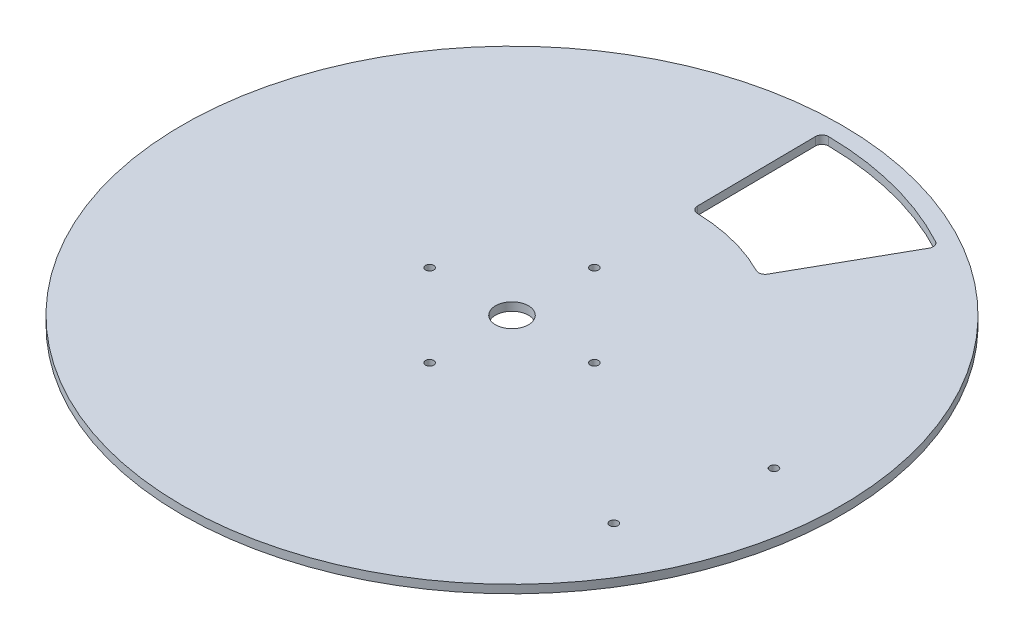
ISO-10303-21;
HEADER;
FILE_DESCRIPTION(('STEP AP214'),'2;1');
FILE_NAME('part.step','',(''),(''),'','','');
FILE_SCHEMA(('AUTOMOTIVE_DESIGN { 1 0 10303 214 1 1 1 1 }'));
ENDSEC;
DATA;
#1=APPLICATION_CONTEXT('core data for automotive mechanical design processes');
#2=APPLICATION_PROTOCOL_DEFINITION('international standard','automotive_design',2000,#1);
#3=PRODUCT_CONTEXT('',#1,'mechanical');
#4=PRODUCT('Part','Part','',(#3));
#5=PRODUCT_RELATED_PRODUCT_CATEGORY('part','',(#4));
#6=PRODUCT_DEFINITION_FORMATION('','',#4);
#7=PRODUCT_DEFINITION_CONTEXT('part definition',#1,'design');
#8=PRODUCT_DEFINITION('design','',#6,#7);
#9=PRODUCT_DEFINITION_SHAPE('','',#8);
#10=(LENGTH_UNIT() NAMED_UNIT(*) SI_UNIT(.MILLI.,.METRE.));
#11=(NAMED_UNIT(*) PLANE_ANGLE_UNIT() SI_UNIT($,.RADIAN.));
#12=(NAMED_UNIT(*) SI_UNIT($,.STERADIAN.) SOLID_ANGLE_UNIT());
#13=UNCERTAINTY_MEASURE_WITH_UNIT(LENGTH_MEASURE(1.E-05),#10,'distance_accuracy_value','');
#14=(GEOMETRIC_REPRESENTATION_CONTEXT(3) GLOBAL_UNCERTAINTY_ASSIGNED_CONTEXT((#13)) GLOBAL_UNIT_ASSIGNED_CONTEXT((#10,
#11,#12)) REPRESENTATION_CONTEXT('',''));
#15=CARTESIAN_POINT('',(0.,0.,0.));
#16=DIRECTION('',(0.,0.,1.));
#17=DIRECTION('',(1.,0.,0.));
#18=AXIS2_PLACEMENT_3D('',#15,#16,#17);
#19=CARTESIAN_POINT('',(0.,3.175,0.));
#20=DIRECTION('',(0.,1.,0.));
#21=DIRECTION('',(0.,0.,1.));
#22=AXIS2_PLACEMENT_3D('',#19,#20,#21);
#23=PLANE('',#22);
#24=CARTESIAN_POINT('',(0.,3.175,0.));
#25=DIRECTION('',(0.,1.,0.));
#26=DIRECTION('',(0.,0.,1.));
#27=AXIS2_PLACEMENT_3D('',#24,#25,#26);
#28=CIRCLE('',#27,127.);
#29=CARTESIAN_POINT('',(0.,3.175,127.));
#30=VERTEX_POINT('',#29);
#31=EDGE_CURVE('E138',#30,#30,#28,.T.);
#32=ORIENTED_EDGE('',*,*,#31,.T.);
#33=EDGE_LOOP('',(#32));
#34=FACE_BOUND('',#33,.T.);
#35=CARTESIAN_POINT('',(0.,3.175,0.));
#36=DIRECTION('',(0.,1.,0.));
#37=DIRECTION('',(0.,0.,1.));
#38=AXIS2_PLACEMENT_3D('',#35,#36,#37);
#39=CIRCLE('',#38,6.35);
#40=CARTESIAN_POINT('',(0.,3.175,6.35));
#41=VERTEX_POINT('',#40);
#42=EDGE_CURVE('E135',#41,#41,#39,.T.);
#43=ORIENTED_EDGE('',*,*,#42,.F.);
#44=EDGE_LOOP('',(#43));
#45=FACE_BOUND('',#44,.T.);
#46=CARTESIAN_POINT('',(0.0105004159452068,3.175,1.05154165394142));
#47=DIRECTION('',(0.,-1.,0.));
#48=DIRECTION('',(0.,0.,-1.));
#49=AXIS2_PLACEMENT_3D('',#46,#47,#48);
#50=CIRCLE('',#49,70.7626606637661);
#51=CARTESIAN_POINT('',(1.7562073903253,3.175,-69.6895825340082));
#52=VERTEX_POINT('',#51);
#53=CARTESIAN_POINT('',(32.1700210350617,3.175,-61.981143341733));
#54=VERTEX_POINT('',#53);
#55=EDGE_CURVE('E181',#52,#54,#50,.T.);
#56=ORIENTED_EDGE('',*,*,#55,.F.);
#57=CARTESIAN_POINT('',(1.81886890804288,3.175,-72.2288094900318));
#58=DIRECTION('',(0.,1.,0.));
#59=DIRECTION('',(0.,0.,1.));
#60=AXIS2_PLACEMENT_3D('',#57,#58,#59);
#61=CIRCLE('',#60,2.54);
#62=CARTESIAN_POINT('',(-0.721004463508169,3.175,-72.2034469884614));
#63=VERTEX_POINT('',#62);
#64=EDGE_CURVE('E41',#52,#63,#61,.F.);
#65=ORIENTED_EDGE('',*,*,#64,.T.);
#66=DIRECTION('',(0.00998523683874398,0.,0.99995014627994));
#67=VECTOR('',#66,1.);
#68=CARTESIAN_POINT('',(-0.69608151012217,3.175,-69.7075912279492));
#69=LINE('',#68,#67);
#70=CARTESIAN_POINT('',(-1.17908155429488,3.175,-118.076595651532));
#71=VERTEX_POINT('',#70);
#72=EDGE_CURVE('E114',#71,#63,#69,.T.);
#73=ORIENTED_EDGE('',*,*,#72,.F.);
#74=CARTESIAN_POINT('',(1.36079181725616,3.175,-118.101958153102));
#75=DIRECTION('',(0.,1.,0.));
#76=DIRECTION('',(0.,0.,1.));
#77=AXIS2_PLACEMENT_3D('',#74,#75,#76);
#78=CIRCLE('',#77,2.54);
#79=CARTESIAN_POINT('',(1.39046106139556,3.175,-120.641784866867));
#80=VERTEX_POINT('',#79);
#81=EDGE_CURVE('E98',#71,#80,#78,.F.);
#82=ORIENTED_EDGE('',*,*,#81,.T.);
#83=CARTESIAN_POINT('',(-0.00867728375355766,3.175,-0.868967987320571));
#84=DIRECTION('',(0.,1.,0.));
#85=DIRECTION('',(0.,0.,-1.));
#86=AXIS2_PLACEMENT_3D('',#83,#84,#85);
#87=CIRCLE('',#86,119.780988689233);
#88=CARTESIAN_POINT('',(56.9599757170439,3.175,-106.235271076329));
#89=VERTEX_POINT('',#88);
#90=EDGE_CURVE('E123',#89,#80,#87,.T.);
#91=ORIENTED_EDGE('',*,*,#90,.F.);
#92=CARTESIAN_POINT('',(55.7519344393296,3.175,-104.000939795758));
#93=DIRECTION('',(0.,1.,0.));
#94=DIRECTION('',(0.,0.,1.));
#95=AXIS2_PLACEMENT_3D('',#92,#93,#94);
#96=CIRCLE('',#95,2.54);
#97=CARTESIAN_POINT('',(57.9642105522736,3.175,-102.752967680646));
#98=VERTEX_POINT('',#97);
#99=EDGE_CURVE('E157',#89,#98,#96,.F.);
#100=ORIENTED_EDGE('',*,*,#99,.T.);
#101=DIRECTION('',(0.491327604374815,0.,-0.870974847615765));
#102=VECTOR('',#101,1.);
#103=CARTESIAN_POINT('',(34.3192331655808,3.175,-60.8375931059612));
#104=LINE('',#103,#102);
#105=CARTESIAN_POINT('',(35.5366514586879,3.175,-62.9957065579274));
#106=VERTEX_POINT('',#105);
#107=EDGE_CURVE('E127',#106,#98,#104,.T.);
#108=ORIENTED_EDGE('',*,*,#107,.F.);
#109=CARTESIAN_POINT('',(33.3243753457439,3.175,-64.2436786730394));
#110=DIRECTION('',(0.,1.,0.));
#111=DIRECTION('',(0.,0.,1.));
#112=AXIS2_PLACEMENT_3D('',#109,#110,#111);
#113=CIRCLE('',#112,2.54);
#114=EDGE_CURVE('E161',#106,#54,#113,.F.);
#115=ORIENTED_EDGE('',*,*,#114,.T.);
#116=EDGE_LOOP('',(#56,#65,#73,#82,#91,#100,#108,#115));
#117=FACE_BOUND('',#116,.T.);
#118=CARTESIAN_POINT('',(0.,3.175,31.75));
#119=DIRECTION('',(0.,1.,0.));
#120=DIRECTION('',(0.,0.,1.));
#121=AXIS2_PLACEMENT_3D('',#118,#119,#120);
#122=CIRCLE('',#121,1.5875);
#123=CARTESIAN_POINT('',(0.,3.175,33.3375));
#124=VERTEX_POINT('',#123);
#125=EDGE_CURVE('E187',#124,#124,#122,.T.);
#126=ORIENTED_EDGE('',*,*,#125,.F.);
#127=EDGE_LOOP('',(#126));
#128=FACE_BOUND('',#127,.T.);
#129=CARTESIAN_POINT('',(-31.75,3.175,3.32563597524808E-13));
#130=DIRECTION('',(0.,1.,0.));
#131=DIRECTION('',(-1.,0.,0.));
#132=AXIS2_PLACEMENT_3D('',#129,#130,#131);
#133=CIRCLE('',#132,1.5875);
#134=CARTESIAN_POINT('',(-33.3375,3.175,3.49191777401049E-13));
#135=VERTEX_POINT('',#134);
#136=EDGE_CURVE('E195',#135,#135,#133,.T.);
#137=ORIENTED_EDGE('',*,*,#136,.F.);
#138=EDGE_LOOP('',(#137));
#139=FACE_BOUND('',#138,.T.);
#140=CARTESIAN_POINT('',(0.,3.175,-31.75));
#141=DIRECTION('',(0.,1.,0.));
#142=DIRECTION('',(0.,0.,-1.));
#143=AXIS2_PLACEMENT_3D('',#140,#141,#142);
#144=CIRCLE('',#143,1.5875);
#145=CARTESIAN_POINT('',(0.,3.175,-33.3375));
#146=VERTEX_POINT('',#145);
#147=EDGE_CURVE('E202',#146,#146,#144,.T.);
#148=ORIENTED_EDGE('',*,*,#147,.F.);
#149=EDGE_LOOP('',(#148));
#150=FACE_BOUND('',#149,.T.);
#151=CARTESIAN_POINT('',(31.75,3.175,-1.10854532508269E-13));
#152=DIRECTION('',(0.,1.,0.));
#153=DIRECTION('',(1.,0.,0.));
#154=AXIS2_PLACEMENT_3D('',#151,#152,#153);
#155=CIRCLE('',#154,1.5875);
#156=CARTESIAN_POINT('',(33.3375,3.175,-1.16397259133683E-13));
#157=VERTEX_POINT('',#156);
#158=EDGE_CURVE('E208',#157,#157,#155,.T.);
#159=ORIENTED_EDGE('',*,*,#158,.F.);
#160=EDGE_LOOP('',(#159));
#161=FACE_BOUND('',#160,.T.);
#162=CARTESIAN_POINT('',(89.0619549822179,3.175,49.8249269557116));
#163=DIRECTION('',(0.,-1.,0.));
#164=DIRECTION('',(0.,0.,-1.));
#165=AXIS2_PLACEMENT_3D('',#162,#163,#164);
#166=CIRCLE('',#165,1.5875);
#167=CARTESIAN_POINT('',(89.0619549822179,3.175,48.2374269557116));
#168=VERTEX_POINT('',#167);
#169=EDGE_CURVE('E213',#168,#168,#166,.T.);
#170=ORIENTED_EDGE('',*,*,#169,.T.);
#171=EDGE_LOOP('',(#170));
#172=FACE_BOUND('',#171,.T.);
#173=CARTESIAN_POINT('',(101.542683253293,3.175,0.581943477620146));
#174=DIRECTION('',(0.,1.,0.));
#175=DIRECTION('',(0.,0.,1.));
#176=AXIS2_PLACEMENT_3D('',#173,#174,#175);
#177=CIRCLE('',#176,1.58749999999998);
#178=CARTESIAN_POINT('',(101.542683253293,3.175,2.16944347762013));
#179=VERTEX_POINT('',#178);
#180=EDGE_CURVE('E199',#179,#179,#177,.T.);
#181=ORIENTED_EDGE('',*,*,#180,.F.);
#182=EDGE_LOOP('',(#181));
#183=FACE_BOUND('',#182,.T.);
#184=ADVANCED_FACE('F33',(#34,#45,#117,#128,#139,#150,#161,#172,#183),#23,.T.);
#185=CARTESIAN_POINT('',(0.,0.,0.));
#186=DIRECTION('',(0.,1.,0.));
#187=DIRECTION('',(0.,0.,1.));
#188=AXIS2_PLACEMENT_3D('',#185,#186,#187);
#189=PLANE('',#188);
#190=CARTESIAN_POINT('',(89.0619549822179,0.,49.8249269557116));
#191=DIRECTION('',(0.,-1.,0.));
#192=DIRECTION('',(0.,0.,-1.));
#193=AXIS2_PLACEMENT_3D('',#190,#191,#192);
#194=CIRCLE('',#193,1.5875);
#195=CARTESIAN_POINT('',(89.0619549822179,0.,48.2374269557116));
#196=VERTEX_POINT('',#195);
#197=EDGE_CURVE('E216',#196,#196,#194,.T.);
#198=ORIENTED_EDGE('',*,*,#197,.F.);
#199=EDGE_LOOP('',(#198));
#200=FACE_BOUND('',#199,.T.);
#201=CARTESIAN_POINT('',(31.75,0.,-1.10854532508269E-13));
#202=DIRECTION('',(0.,1.,0.));
#203=DIRECTION('',(1.,0.,0.));
#204=AXIS2_PLACEMENT_3D('',#201,#202,#203);
#205=CIRCLE('',#204,1.5875);
#206=CARTESIAN_POINT('',(33.3375,0.,-1.16397259133683E-13));
#207=VERTEX_POINT('',#206);
#208=EDGE_CURVE('E193',#207,#207,#205,.T.);
#209=ORIENTED_EDGE('',*,*,#208,.T.);
#210=EDGE_LOOP('',(#209));
#211=FACE_BOUND('',#210,.T.);
#212=CARTESIAN_POINT('',(0.,0.,-31.75));
#213=DIRECTION('',(0.,1.,0.));
#214=DIRECTION('',(0.,0.,-1.));
#215=AXIS2_PLACEMENT_3D('',#212,#213,#214);
#216=CIRCLE('',#215,1.5875);
#217=CARTESIAN_POINT('',(0.,0.,-33.3375));
#218=VERTEX_POINT('',#217);
#219=EDGE_CURVE('E205',#218,#218,#216,.T.);
#220=ORIENTED_EDGE('',*,*,#219,.T.);
#221=EDGE_LOOP('',(#220));
#222=FACE_BOUND('',#221,.T.);
#223=CARTESIAN_POINT('',(-31.75,0.,3.32563597524808E-13));
#224=DIRECTION('',(0.,1.,0.));
#225=DIRECTION('',(-1.,0.,0.));
#226=AXIS2_PLACEMENT_3D('',#223,#224,#225);
#227=CIRCLE('',#226,1.5875);
#228=CARTESIAN_POINT('',(-33.3375,0.,3.49191777401049E-13));
#229=VERTEX_POINT('',#228);
#230=EDGE_CURVE('E198',#229,#229,#227,.T.);
#231=ORIENTED_EDGE('',*,*,#230,.T.);
#232=EDGE_LOOP('',(#231));
#233=FACE_BOUND('',#232,.T.);
#234=CARTESIAN_POINT('',(0.,0.,31.75));
#235=DIRECTION('',(0.,1.,0.));
#236=DIRECTION('',(0.,0.,1.));
#237=AXIS2_PLACEMENT_3D('',#234,#235,#236);
#238=CIRCLE('',#237,1.5875);
#239=CARTESIAN_POINT('',(0.,0.,33.3375));
#240=VERTEX_POINT('',#239);
#241=EDGE_CURVE('E184',#240,#240,#238,.T.);
#242=ORIENTED_EDGE('',*,*,#241,.T.);
#243=EDGE_LOOP('',(#242));
#244=FACE_BOUND('',#243,.T.);
#245=CARTESIAN_POINT('',(-0.00867728375355766,0.,-0.868967987320571));
#246=DIRECTION('',(0.,1.,0.));
#247=DIRECTION('',(0.,0.,-1.));
#248=AXIS2_PLACEMENT_3D('',#245,#246,#247);
#249=CIRCLE('',#248,119.780988689233);
#250=CARTESIAN_POINT('',(56.9599757170439,0.,-106.235271076329));
#251=VERTEX_POINT('',#250);
#252=CARTESIAN_POINT('',(1.39046106139556,0.,-120.641784866867));
#253=VERTEX_POINT('',#252);
#254=EDGE_CURVE('E178',#251,#253,#249,.T.);
#255=ORIENTED_EDGE('',*,*,#254,.T.);
#256=CARTESIAN_POINT('',(1.36079181725616,0.,-118.101958153102));
#257=DIRECTION('',(0.,1.,0.));
#258=DIRECTION('',(0.,0.,1.));
#259=AXIS2_PLACEMENT_3D('',#256,#257,#258);
#260=CIRCLE('',#259,2.54);
#261=CARTESIAN_POINT('',(-1.17908155429488,0.,-118.076595651532));
#262=VERTEX_POINT('',#261);
#263=EDGE_CURVE('E108',#253,#262,#260,.T.);
#264=ORIENTED_EDGE('',*,*,#263,.T.);
#265=DIRECTION('',(0.00998523683874398,0.,0.99995014627994));
#266=VECTOR('',#265,1.);
#267=CARTESIAN_POINT('',(-0.69608151012217,0.,-69.7075912279492));
#268=LINE('',#267,#266);
#269=CARTESIAN_POINT('',(-0.721004463508169,0.,-72.2034469884614));
#270=VERTEX_POINT('',#269);
#271=EDGE_CURVE('E116',#262,#270,#268,.T.);
#272=ORIENTED_EDGE('',*,*,#271,.T.);
#273=CARTESIAN_POINT('',(1.81886890804288,0.,-72.2288094900318));
#274=DIRECTION('',(0.,1.,0.));
#275=DIRECTION('',(0.,0.,1.));
#276=AXIS2_PLACEMENT_3D('',#273,#274,#275);
#277=CIRCLE('',#276,2.54);
#278=CARTESIAN_POINT('',(1.7562073903253,0.,-69.6895825340082));
#279=VERTEX_POINT('',#278);
#280=EDGE_CURVE('E11',#270,#279,#277,.T.);
#281=ORIENTED_EDGE('',*,*,#280,.T.);
#282=CARTESIAN_POINT('',(0.0105004159452068,0.,1.05154165394142));
#283=DIRECTION('',(0.,-1.,0.));
#284=DIRECTION('',(0.,0.,-1.));
#285=AXIS2_PLACEMENT_3D('',#282,#283,#284);
#286=CIRCLE('',#285,70.7626606637661);
#287=CARTESIAN_POINT('',(32.1700210350617,0.,-61.981143341733));
#288=VERTEX_POINT('',#287);
#289=EDGE_CURVE('E122',#279,#288,#286,.T.);
#290=ORIENTED_EDGE('',*,*,#289,.T.);
#291=CARTESIAN_POINT('',(33.3243753457439,0.,-64.2436786730394));
#292=DIRECTION('',(0.,1.,0.));
#293=DIRECTION('',(0.,0.,1.));
#294=AXIS2_PLACEMENT_3D('',#291,#292,#293);
#295=CIRCLE('',#294,2.54);
#296=CARTESIAN_POINT('',(35.5366514586879,0.,-62.9957065579274));
#297=VERTEX_POINT('',#296);
#298=EDGE_CURVE('E163',#288,#297,#295,.T.);
#299=ORIENTED_EDGE('',*,*,#298,.T.);
#300=DIRECTION('',(0.491327604374815,0.,-0.870974847615765));
#301=VECTOR('',#300,1.);
#302=CARTESIAN_POINT('',(34.3192331655808,0.,-60.8375931059612));
#303=LINE('',#302,#301);
#304=CARTESIAN_POINT('',(57.9642105522736,0.,-102.752967680646));
#305=VERTEX_POINT('',#304);
#306=EDGE_CURVE('E125',#297,#305,#303,.T.);
#307=ORIENTED_EDGE('',*,*,#306,.T.);
#308=CARTESIAN_POINT('',(55.7519344393296,0.,-104.000939795758));
#309=DIRECTION('',(0.,1.,0.));
#310=DIRECTION('',(0.,0.,1.));
#311=AXIS2_PLACEMENT_3D('',#308,#309,#310);
#312=CIRCLE('',#311,2.54);
#313=EDGE_CURVE('E159',#305,#251,#312,.T.);
#314=ORIENTED_EDGE('',*,*,#313,.T.);
#315=EDGE_LOOP('',(#255,#264,#272,#281,#290,#299,#307,#314));
#316=FACE_BOUND('',#315,.T.);
#317=CARTESIAN_POINT('',(0.,0.,0.));
#318=DIRECTION('',(0.,1.,0.));
#319=DIRECTION('',(0.,0.,1.));
#320=AXIS2_PLACEMENT_3D('',#317,#318,#319);
#321=CIRCLE('',#320,6.35);
#322=CARTESIAN_POINT('',(0.,0.,6.35));
#323=VERTEX_POINT('',#322);
#324=EDGE_CURVE('E131',#323,#323,#321,.T.);
#325=ORIENTED_EDGE('',*,*,#324,.T.);
#326=EDGE_LOOP('',(#325));
#327=FACE_BOUND('',#326,.T.);
#328=CARTESIAN_POINT('',(0.,0.,0.));
#329=DIRECTION('',(0.,1.,0.));
#330=DIRECTION('',(0.,0.,1.));
#331=AXIS2_PLACEMENT_3D('',#328,#329,#330);
#332=CIRCLE('',#331,127.);
#333=CARTESIAN_POINT('',(0.,0.,127.));
#334=VERTEX_POINT('',#333);
#335=EDGE_CURVE('E134',#334,#334,#332,.T.);
#336=ORIENTED_EDGE('',*,*,#335,.F.);
#337=EDGE_LOOP('',(#336));
#338=FACE_BOUND('',#337,.T.);
#339=CARTESIAN_POINT('',(101.542683253293,0.,0.581943477620146));
#340=DIRECTION('',(0.,1.,0.));
#341=DIRECTION('',(0.,0.,1.));
#342=AXIS2_PLACEMENT_3D('',#339,#340,#341);
#343=CIRCLE('',#342,1.58749999999998);
#344=CARTESIAN_POINT('',(101.542683253293,0.,2.16944347762013));
#345=VERTEX_POINT('',#344);
#346=EDGE_CURVE('E219',#345,#345,#343,.T.);
#347=ORIENTED_EDGE('',*,*,#346,.T.);
#348=EDGE_LOOP('',(#347));
#349=FACE_BOUND('',#348,.T.);
#350=ADVANCED_FACE('F168',(#200,#211,#222,#233,#244,#316,#327,#338,#349),#189,.F.);
#351=CARTESIAN_POINT('',(0.,3.175,0.));
#352=DIRECTION('',(0.,-1.,0.));
#353=DIRECTION('',(0.,0.,-1.));
#354=AXIS2_PLACEMENT_3D('',#351,#352,#353);
#355=CYLINDRICAL_SURFACE('',#354,127.);
#356=ORIENTED_EDGE('',*,*,#31,.F.);
#357=EDGE_LOOP('',(#356));
#358=FACE_BOUND('',#357,.T.);
#359=ORIENTED_EDGE('',*,*,#335,.T.);
#360=EDGE_LOOP('',(#359));
#361=FACE_BOUND('',#360,.T.);
#362=ADVANCED_FACE('F235',(#358,#361),#355,.T.);
#363=CARTESIAN_POINT('',(0.,0.,0.));
#364=DIRECTION('',(0.,1.,0.));
#365=DIRECTION('',(0.,0.,1.));
#366=AXIS2_PLACEMENT_3D('',#363,#364,#365);
#367=CYLINDRICAL_SURFACE('',#366,6.35);
#368=ORIENTED_EDGE('',*,*,#324,.F.);
#369=EDGE_LOOP('',(#368));
#370=FACE_BOUND('',#369,.T.);
#371=ORIENTED_EDGE('',*,*,#42,.T.);
#372=EDGE_LOOP('',(#371));
#373=FACE_BOUND('',#372,.T.);
#374=ADVANCED_FACE('F240',(#370,#373),#367,.F.);
#375=CARTESIAN_POINT('',(0.0105004159452068,0.,1.05154165394142));
#376=DIRECTION('',(0.,1.,0.));
#377=DIRECTION('',(0.,0.,1.));
#378=AXIS2_PLACEMENT_3D('',#375,#376,#377);
#379=CYLINDRICAL_SURFACE('',#378,70.7626606637661);
#380=ORIENTED_EDGE('',*,*,#55,.T.);
#381=DIRECTION('',(0.,1.,0.));
#382=VECTOR('',#381,1.);
#383=CARTESIAN_POINT('',(32.1700210350617,0.,-61.981143341733));
#384=LINE('',#383,#382);
#385=EDGE_CURVE('E48',#54,#288,#384,.F.);
#386=ORIENTED_EDGE('',*,*,#385,.T.);
#387=ORIENTED_EDGE('',*,*,#289,.F.);
#388=DIRECTION('',(0.,1.,0.));
#389=VECTOR('',#388,1.);
#390=CARTESIAN_POINT('',(1.7562073903253,0.,-69.6895825340082));
#391=LINE('',#390,#389);
#392=EDGE_CURVE('E152',#279,#52,#391,.T.);
#393=ORIENTED_EDGE('',*,*,#392,.T.);
#394=EDGE_LOOP('',(#380,#386,#387,#393));
#395=FACE_BOUND('',#394,.T.);
#396=ADVANCED_FACE('F182',(#395),#379,.T.);
#397=CARTESIAN_POINT('',(-0.69608151012217,0.,-69.7075912279492));
#398=DIRECTION('',(-0.99995014627994,0.,0.00998523683874398));
#399=DIRECTION('',(0.00998523683874398,0.,0.99995014627994));
#400=AXIS2_PLACEMENT_3D('',#397,#398,#399);
#401=PLANE('',#400);
#402=ORIENTED_EDGE('',*,*,#271,.F.);
#403=DIRECTION('',(0.,-1.,0.));
#404=VECTOR('',#403,1.);
#405=CARTESIAN_POINT('',(-1.17908155429488,3.175,-118.076595651532));
#406=LINE('',#405,#404);
#407=EDGE_CURVE('E102',#262,#71,#406,.F.);
#408=ORIENTED_EDGE('',*,*,#407,.T.);
#409=ORIENTED_EDGE('',*,*,#72,.T.);
#410=DIRECTION('',(0.,-1.,0.));
#411=VECTOR('',#410,1.);
#412=CARTESIAN_POINT('',(-0.721004463508169,0.,-72.2034469884614));
#413=LINE('',#412,#411);
#414=EDGE_CURVE('E118',#63,#270,#413,.T.);
#415=ORIENTED_EDGE('',*,*,#414,.T.);
#416=EDGE_LOOP('',(#402,#408,#409,#415));
#417=FACE_BOUND('',#416,.T.);
#418=ADVANCED_FACE('F113',(#417),#401,.F.);
#419=CARTESIAN_POINT('',(-0.00867728375355766,0.,-0.868967987320571));
#420=DIRECTION('',(0.,1.,0.));
#421=DIRECTION('',(0.,0.,1.));
#422=AXIS2_PLACEMENT_3D('',#419,#420,#421);
#423=CYLINDRICAL_SURFACE('',#422,119.780988689233);
#424=ORIENTED_EDGE('',*,*,#90,.T.);
#425=DIRECTION('',(0.,1.,0.));
#426=VECTOR('',#425,1.);
#427=CARTESIAN_POINT('',(1.39046106139556,0.,-120.641784866867));
#428=LINE('',#427,#426);
#429=EDGE_CURVE('E103',#80,#253,#428,.F.);
#430=ORIENTED_EDGE('',*,*,#429,.T.);
#431=ORIENTED_EDGE('',*,*,#254,.F.);
#432=DIRECTION('',(0.,1.,0.));
#433=VECTOR('',#432,1.);
#434=CARTESIAN_POINT('',(56.9599757170439,0.,-106.235271076329));
#435=LINE('',#434,#433);
#436=EDGE_CURVE('E117',#251,#89,#435,.T.);
#437=ORIENTED_EDGE('',*,*,#436,.T.);
#438=EDGE_LOOP('',(#424,#430,#431,#437));
#439=FACE_BOUND('',#438,.T.);
#440=ADVANCED_FACE('F266',(#439),#423,.F.);
#441=CARTESIAN_POINT('',(34.3192331655808,0.,-60.8375931059612));
#442=DIRECTION('',(0.870974847615765,0.,0.491327604374815));
#443=DIRECTION('',(0.491327604374815,0.,-0.870974847615765));
#444=AXIS2_PLACEMENT_3D('',#441,#442,#443);
#445=PLANE('',#444);
#446=ORIENTED_EDGE('',*,*,#107,.T.);
#447=DIRECTION('',(0.,-1.,0.));
#448=VECTOR('',#447,1.);
#449=CARTESIAN_POINT('',(57.9642105522736,0.,-102.752967680646));
#450=LINE('',#449,#448);
#451=EDGE_CURVE('E150',#98,#305,#450,.T.);
#452=ORIENTED_EDGE('',*,*,#451,.T.);
#453=ORIENTED_EDGE('',*,*,#306,.F.);
#454=DIRECTION('',(0.,-1.,0.));
#455=VECTOR('',#454,1.);
#456=CARTESIAN_POINT('',(35.5366514586879,3.175,-62.9957065579274));
#457=LINE('',#456,#455);
#458=EDGE_CURVE('E147',#297,#106,#457,.F.);
#459=ORIENTED_EDGE('',*,*,#458,.T.);
#460=EDGE_LOOP('',(#446,#452,#453,#459));
#461=FACE_BOUND('',#460,.T.);
#462=ADVANCED_FACE('F175',(#461),#445,.F.);
#463=CARTESIAN_POINT('',(0.,0.,31.75));
#464=DIRECTION('',(0.,1.,0.));
#465=DIRECTION('',(0.,0.,1.));
#466=AXIS2_PLACEMENT_3D('',#463,#464,#465);
#467=CYLINDRICAL_SURFACE('',#466,1.5875);
#468=ORIENTED_EDGE('',*,*,#241,.F.);
#469=EDGE_LOOP('',(#468));
#470=FACE_BOUND('',#469,.T.);
#471=ORIENTED_EDGE('',*,*,#125,.T.);
#472=EDGE_LOOP('',(#471));
#473=FACE_BOUND('',#472,.T.);
#474=ADVANCED_FACE('F273',(#470,#473),#467,.F.);
#475=CARTESIAN_POINT('',(-31.75,0.,3.32563597524808E-13));
#476=DIRECTION('',(0.,1.,0.));
#477=DIRECTION('',(0.,0.,1.));
#478=AXIS2_PLACEMENT_3D('',#475,#476,#477);
#479=CYLINDRICAL_SURFACE('',#478,1.5875);
#480=ORIENTED_EDGE('',*,*,#230,.F.);
#481=EDGE_LOOP('',(#480));
#482=FACE_BOUND('',#481,.T.);
#483=ORIENTED_EDGE('',*,*,#136,.T.);
#484=EDGE_LOOP('',(#483));
#485=FACE_BOUND('',#484,.T.);
#486=ADVANCED_FACE('F303',(#482,#485),#479,.F.);
#487=CARTESIAN_POINT('',(0.,0.,-31.75));
#488=DIRECTION('',(0.,1.,0.));
#489=DIRECTION('',(0.,0.,1.));
#490=AXIS2_PLACEMENT_3D('',#487,#488,#489);
#491=CYLINDRICAL_SURFACE('',#490,1.5875);
#492=ORIENTED_EDGE('',*,*,#219,.F.);
#493=EDGE_LOOP('',(#492));
#494=FACE_BOUND('',#493,.T.);
#495=ORIENTED_EDGE('',*,*,#147,.T.);
#496=EDGE_LOOP('',(#495));
#497=FACE_BOUND('',#496,.T.);
#498=ADVANCED_FACE('F299',(#494,#497),#491,.F.);
#499=CARTESIAN_POINT('',(31.75,0.,-1.10854532508269E-13));
#500=DIRECTION('',(0.,1.,0.));
#501=DIRECTION('',(0.,0.,1.));
#502=AXIS2_PLACEMENT_3D('',#499,#500,#501);
#503=CYLINDRICAL_SURFACE('',#502,1.5875);
#504=ORIENTED_EDGE('',*,*,#208,.F.);
#505=EDGE_LOOP('',(#504));
#506=FACE_BOUND('',#505,.T.);
#507=ORIENTED_EDGE('',*,*,#158,.T.);
#508=EDGE_LOOP('',(#507));
#509=FACE_BOUND('',#508,.T.);
#510=ADVANCED_FACE('F249',(#506,#509),#503,.F.);
#511=CARTESIAN_POINT('',(1.36079181725616,0.,-118.101958153102));
#512=DIRECTION('',(0.,1.,0.));
#513=DIRECTION('',(0.,0.,1.));
#514=AXIS2_PLACEMENT_3D('',#511,#512,#513);
#515=CYLINDRICAL_SURFACE('',#514,2.54);
#516=ORIENTED_EDGE('',*,*,#263,.F.);
#517=ORIENTED_EDGE('',*,*,#429,.F.);
#518=ORIENTED_EDGE('',*,*,#81,.F.);
#519=ORIENTED_EDGE('',*,*,#407,.F.);
#520=EDGE_LOOP('',(#516,#517,#518,#519));
#521=FACE_BOUND('',#520,.T.);
#522=ADVANCED_FACE('F101',(#521),#515,.F.);
#523=CARTESIAN_POINT('',(55.7519344393296,0.,-104.000939795758));
#524=DIRECTION('',(0.,1.,0.));
#525=DIRECTION('',(0.,0.,1.));
#526=AXIS2_PLACEMENT_3D('',#523,#524,#525);
#527=CYLINDRICAL_SURFACE('',#526,2.54);
#528=ORIENTED_EDGE('',*,*,#313,.F.);
#529=ORIENTED_EDGE('',*,*,#451,.F.);
#530=ORIENTED_EDGE('',*,*,#99,.F.);
#531=ORIENTED_EDGE('',*,*,#436,.F.);
#532=EDGE_LOOP('',(#528,#529,#530,#531));
#533=FACE_BOUND('',#532,.T.);
#534=ADVANCED_FACE('F248',(#533),#527,.F.);
#535=CARTESIAN_POINT('',(33.3243753457439,0.,-64.2436786730394));
#536=DIRECTION('',(0.,1.,0.));
#537=DIRECTION('',(0.,0.,1.));
#538=AXIS2_PLACEMENT_3D('',#535,#536,#537);
#539=CYLINDRICAL_SURFACE('',#538,2.54);
#540=ORIENTED_EDGE('',*,*,#298,.F.);
#541=ORIENTED_EDGE('',*,*,#385,.F.);
#542=ORIENTED_EDGE('',*,*,#114,.F.);
#543=ORIENTED_EDGE('',*,*,#458,.F.);
#544=EDGE_LOOP('',(#540,#541,#542,#543));
#545=FACE_BOUND('',#544,.T.);
#546=ADVANCED_FACE('F180',(#545),#539,.F.);
#547=CARTESIAN_POINT('',(1.81886890804288,0.,-72.2288094900318));
#548=DIRECTION('',(0.,1.,0.));
#549=DIRECTION('',(0.,0.,1.));
#550=AXIS2_PLACEMENT_3D('',#547,#548,#549);
#551=CYLINDRICAL_SURFACE('',#550,2.54);
#552=ORIENTED_EDGE('',*,*,#280,.F.);
#553=ORIENTED_EDGE('',*,*,#414,.F.);
#554=ORIENTED_EDGE('',*,*,#64,.F.);
#555=ORIENTED_EDGE('',*,*,#392,.F.);
#556=EDGE_LOOP('',(#552,#553,#554,#555));
#557=FACE_BOUND('',#556,.T.);
#558=ADVANCED_FACE('F35',(#557),#551,.F.);
#559=CARTESIAN_POINT('',(89.0619549822179,3.175,49.8249269557116));
#560=DIRECTION('',(0.,-1.,0.));
#561=DIRECTION('',(0.,0.,-1.));
#562=AXIS2_PLACEMENT_3D('',#559,#560,#561);
#563=CYLINDRICAL_SURFACE('',#562,1.5875);
#564=ORIENTED_EDGE('',*,*,#169,.F.);
#565=EDGE_LOOP('',(#564));
#566=FACE_BOUND('',#565,.T.);
#567=ORIENTED_EDGE('',*,*,#197,.T.);
#568=EDGE_LOOP('',(#567));
#569=FACE_BOUND('',#568,.T.);
#570=ADVANCED_FACE('F256',(#566,#569),#563,.F.);
#571=CARTESIAN_POINT('',(101.542683253293,3.175,0.581943477620146));
#572=DIRECTION('',(0.,-1.,0.));
#573=DIRECTION('',(0.,0.,-1.));
#574=AXIS2_PLACEMENT_3D('',#571,#572,#573);
#575=CYLINDRICAL_SURFACE('',#574,1.58749999999998);
#576=ORIENTED_EDGE('',*,*,#180,.T.);
#577=EDGE_LOOP('',(#576));
#578=FACE_BOUND('',#577,.T.);
#579=ORIENTED_EDGE('',*,*,#346,.F.);
#580=EDGE_LOOP('',(#579));
#581=FACE_BOUND('',#580,.T.);
#582=ADVANCED_FACE('F225',(#578,#581),#575,.F.);
#583=CLOSED_SHELL('',(#184,#350,#362,#374,#396,#418,#440,#462,#474,#486,#498,#510,#522,#534,
#546,#558,#570,#582));
#584=MANIFOLD_SOLID_BREP('B2',#583);
#585=ADVANCED_BREP_SHAPE_REPRESENTATION('',(#18,#584),#14);
#586=SHAPE_DEFINITION_REPRESENTATION(#9,#585);
ENDSEC;
END-ISO-10303-21;
